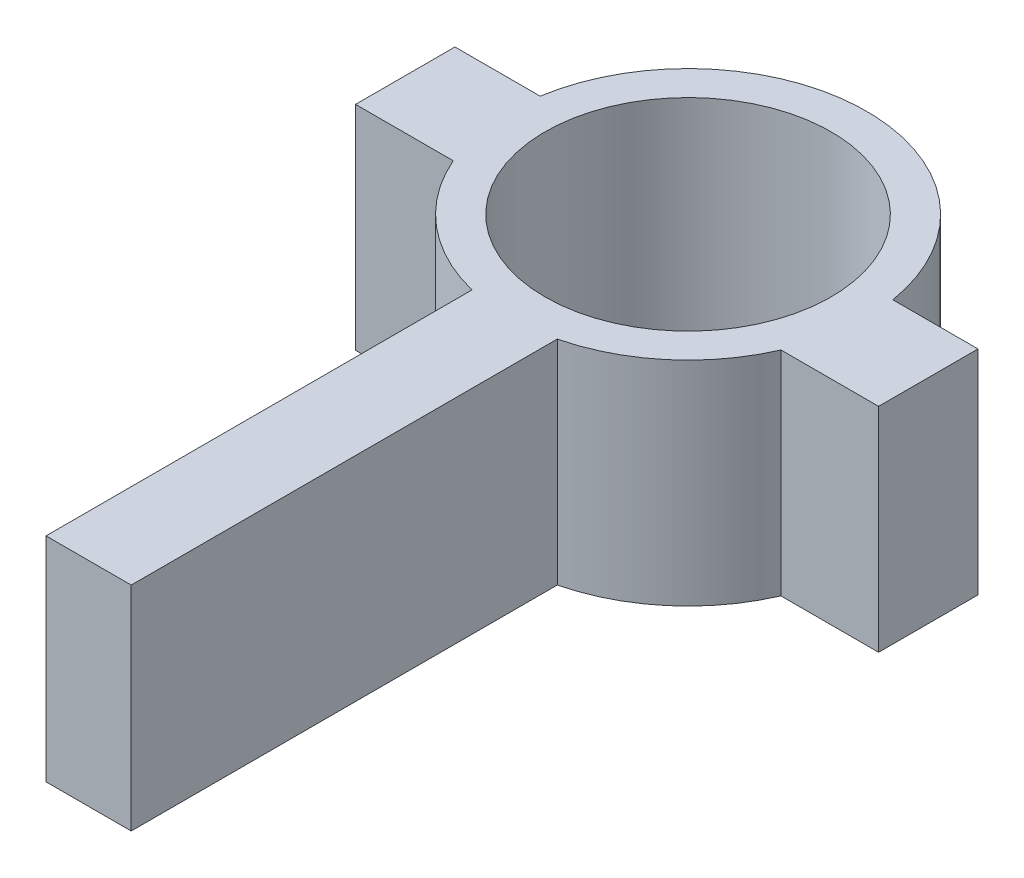
ISO-10303-21;
HEADER;
FILE_DESCRIPTION(('STEP AP214'),'2;1');
FILE_NAME('part.step','',(''),(''),'','','');
FILE_SCHEMA(('AUTOMOTIVE_DESIGN { 1 0 10303 214 1 1 1 1 }'));
ENDSEC;
DATA;
#1=APPLICATION_CONTEXT('core data for automotive mechanical design processes');
#2=APPLICATION_PROTOCOL_DEFINITION('international standard','automotive_design',2000,#1);
#3=PRODUCT_CONTEXT('',#1,'mechanical');
#4=PRODUCT('Part','Part','',(#3));
#5=PRODUCT_RELATED_PRODUCT_CATEGORY('part','',(#4));
#6=PRODUCT_DEFINITION_FORMATION('','',#4);
#7=PRODUCT_DEFINITION_CONTEXT('part definition',#1,'design');
#8=PRODUCT_DEFINITION('design','',#6,#7);
#9=PRODUCT_DEFINITION_SHAPE('','',#8);
#10=(LENGTH_UNIT() NAMED_UNIT(*) SI_UNIT(.MILLI.,.METRE.));
#11=(NAMED_UNIT(*) PLANE_ANGLE_UNIT() SI_UNIT($,.RADIAN.));
#12=(NAMED_UNIT(*) SI_UNIT($,.STERADIAN.) SOLID_ANGLE_UNIT());
#13=UNCERTAINTY_MEASURE_WITH_UNIT(LENGTH_MEASURE(1.E-05),#10,'distance_accuracy_value','');
#14=(GEOMETRIC_REPRESENTATION_CONTEXT(3) GLOBAL_UNCERTAINTY_ASSIGNED_CONTEXT((#13)) GLOBAL_UNIT_ASSIGNED_CONTEXT((#10,
#11,#12)) REPRESENTATION_CONTEXT('',''));
#15=CARTESIAN_POINT('',(0.,0.,0.));
#16=DIRECTION('',(0.,0.,1.));
#17=DIRECTION('',(1.,0.,0.));
#18=AXIS2_PLACEMENT_3D('',#15,#16,#17);
#19=CARTESIAN_POINT('',(0.,30.,10.));
#20=DIRECTION('',(0.,0.,-1.));
#21=DIRECTION('',(-1.,0.,0.));
#22=AXIS2_PLACEMENT_3D('',#19,#20,#21);
#23=PLANE('',#22);
#24=DIRECTION('',(1.,0.,0.));
#25=VECTOR('',#24,1.);
#26=CARTESIAN_POINT('',(0.,0.,10.));
#27=LINE('',#26,#25);
#28=CARTESIAN_POINT('',(23.0764490335927,0.,10.));
#29=VERTEX_POINT('',#28);
#30=CARTESIAN_POINT('',(36.8298711233063,0.,9.99999999999999));
#31=VERTEX_POINT('',#30);
#32=EDGE_CURVE('E174',#29,#31,#27,.T.);
#33=ORIENTED_EDGE('',*,*,#32,.T.);
#34=DIRECTION('',(0.,-1.,0.));
#35=VECTOR('',#34,1.);
#36=CARTESIAN_POINT('',(36.8298711233063,30.,9.99999999999999));
#37=LINE('',#36,#35);
#38=CARTESIAN_POINT('',(36.8298711233063,30.,9.99999999999999));
#39=VERTEX_POINT('',#38);
#40=EDGE_CURVE('E11',#39,#31,#37,.T.);
#41=ORIENTED_EDGE('',*,*,#40,.F.);
#42=DIRECTION('',(1.,0.,0.));
#43=VECTOR('',#42,1.);
#44=CARTESIAN_POINT('',(0.,30.,10.));
#45=LINE('',#44,#43);
#46=CARTESIAN_POINT('',(23.0764490335927,30.,10.));
#47=VERTEX_POINT('',#46);
#48=EDGE_CURVE('E110',#47,#39,#45,.T.);
#49=ORIENTED_EDGE('',*,*,#48,.F.);
#50=DIRECTION('',(0.,-1.,0.));
#51=VECTOR('',#50,1.);
#52=CARTESIAN_POINT('',(23.0764490335927,30.,10.));
#53=LINE('',#52,#51);
#54=EDGE_CURVE('E173',#47,#29,#53,.T.);
#55=ORIENTED_EDGE('',*,*,#54,.T.);
#56=EDGE_LOOP('',(#33,#41,#49,#55));
#57=FACE_BOUND('',#56,.T.);
#58=ADVANCED_FACE('F45',(#57),#23,.F.);
#59=CARTESIAN_POINT('',(36.8298711233063,30.,0.));
#60=DIRECTION('',(1.,0.,0.));
#61=DIRECTION('',(0.,0.,-1.));
#62=AXIS2_PLACEMENT_3D('',#59,#60,#61);
#63=PLANE('',#62);
#64=DIRECTION('',(0.,0.,1.));
#65=VECTOR('',#64,1.);
#66=CARTESIAN_POINT('',(36.8298711233063,0.,0.));
#67=LINE('',#66,#65);
#68=CARTESIAN_POINT('',(36.8298711233063,0.,-4.00000000000001));
#69=VERTEX_POINT('',#68);
#70=EDGE_CURVE('E178',#69,#31,#67,.T.);
#71=ORIENTED_EDGE('',*,*,#70,.F.);
#72=DIRECTION('',(0.,-1.,0.));
#73=VECTOR('',#72,1.);
#74=CARTESIAN_POINT('',(36.8298711233063,30.,-4.00000000000001));
#75=LINE('',#74,#73);
#76=CARTESIAN_POINT('',(36.8298711233063,30.,-4.00000000000001));
#77=VERTEX_POINT('',#76);
#78=EDGE_CURVE('E54',#77,#69,#75,.T.);
#79=ORIENTED_EDGE('',*,*,#78,.F.);
#80=DIRECTION('',(0.,0.,1.));
#81=VECTOR('',#80,1.);
#82=CARTESIAN_POINT('',(36.8298711233063,30.,0.));
#83=LINE('',#82,#81);
#84=EDGE_CURVE('E296',#77,#39,#83,.T.);
#85=ORIENTED_EDGE('',*,*,#84,.T.);
#86=ORIENTED_EDGE('',*,*,#40,.T.);
#87=EDGE_LOOP('',(#71,#79,#85,#86));
#88=FACE_BOUND('',#87,.T.);
#89=ADVANCED_FACE('F251',(#88),#63,.T.);
#90=CARTESIAN_POINT('',(0.,30.,-3.99999999999998));
#91=DIRECTION('',(0.,0.,-1.));
#92=DIRECTION('',(-1.,0.,0.));
#93=AXIS2_PLACEMENT_3D('',#90,#91,#92);
#94=PLANE('',#93);
#95=DIRECTION('',(1.,0.,0.));
#96=VECTOR('',#95,1.);
#97=CARTESIAN_POINT('',(0.,0.,-3.99999999999998));
#98=LINE('',#97,#96);
#99=CARTESIAN_POINT('',(24.8298711233063,0.,-4.));
#100=VERTEX_POINT('',#99);
#101=EDGE_CURVE('E182',#100,#69,#98,.T.);
#102=ORIENTED_EDGE('',*,*,#101,.F.);
#103=DIRECTION('',(0.,-1.,0.));
#104=VECTOR('',#103,1.);
#105=CARTESIAN_POINT('',(24.8298711233063,30.,-4.));
#106=LINE('',#105,#104);
#107=CARTESIAN_POINT('',(24.8298711233063,30.,-4.));
#108=VERTEX_POINT('',#107);
#109=EDGE_CURVE('E239',#108,#100,#106,.T.);
#110=ORIENTED_EDGE('',*,*,#109,.F.);
#111=DIRECTION('',(1.,0.,0.));
#112=VECTOR('',#111,1.);
#113=CARTESIAN_POINT('',(0.,30.,-3.99999999999998));
#114=LINE('',#113,#112);
#115=EDGE_CURVE('E248',#108,#77,#114,.T.);
#116=ORIENTED_EDGE('',*,*,#115,.T.);
#117=ORIENTED_EDGE('',*,*,#78,.T.);
#118=EDGE_LOOP('',(#102,#110,#116,#117));
#119=FACE_BOUND('',#118,.T.);
#120=ADVANCED_FACE('F246',(#119),#94,.T.);
#121=CARTESIAN_POINT('',(0.,30.,0.));
#122=DIRECTION('',(0.,-1.,0.));
#123=DIRECTION('',(0.,0.,-1.));
#124=AXIS2_PLACEMENT_3D('',#121,#122,#123);
#125=CYLINDRICAL_SURFACE('',#124,25.15);
#126=CARTESIAN_POINT('',(0.,0.,0.));
#127=DIRECTION('',(0.,1.,0.));
#128=DIRECTION('',(0.,0.,1.));
#129=AXIS2_PLACEMENT_3D('',#126,#127,#128);
#130=CIRCLE('',#129,25.15);
#131=CARTESIAN_POINT('',(-24.8298711233063,0.,-4.));
#132=VERTEX_POINT('',#131);
#133=EDGE_CURVE('E186',#100,#132,#130,.T.);
#134=ORIENTED_EDGE('',*,*,#133,.T.);
#135=DIRECTION('',(0.,-1.,0.));
#136=VECTOR('',#135,1.);
#137=CARTESIAN_POINT('',(-24.8298711233063,30.,-4.));
#138=LINE('',#137,#136);
#139=CARTESIAN_POINT('',(-24.8298711233063,30.,-4.));
#140=VERTEX_POINT('',#139);
#141=EDGE_CURVE('E235',#140,#132,#138,.T.);
#142=ORIENTED_EDGE('',*,*,#141,.F.);
#143=CARTESIAN_POINT('',(0.,30.,0.));
#144=DIRECTION('',(0.,1.,0.));
#145=DIRECTION('',(0.,0.,1.));
#146=AXIS2_PLACEMENT_3D('',#143,#144,#145);
#147=CIRCLE('',#146,25.15);
#148=EDGE_CURVE('E271',#108,#140,#147,.T.);
#149=ORIENTED_EDGE('',*,*,#148,.F.);
#150=ORIENTED_EDGE('',*,*,#109,.T.);
#151=EDGE_LOOP('',(#134,#142,#149,#150));
#152=FACE_BOUND('',#151,.T.);
#153=ADVANCED_FACE('F261',(#152),#125,.T.);
#154=CARTESIAN_POINT('',(0.,30.,-4.));
#155=DIRECTION('',(0.,0.,1.));
#156=DIRECTION('',(1.,0.,0.));
#157=AXIS2_PLACEMENT_3D('',#154,#155,#156);
#158=PLANE('',#157);
#159=DIRECTION('',(-1.,0.,0.));
#160=VECTOR('',#159,1.);
#161=CARTESIAN_POINT('',(0.,0.,-4.));
#162=LINE('',#161,#160);
#163=CARTESIAN_POINT('',(-36.8298711233063,0.,-4.));
#164=VERTEX_POINT('',#163);
#165=EDGE_CURVE('E189',#132,#164,#162,.T.);
#166=ORIENTED_EDGE('',*,*,#165,.T.);
#167=DIRECTION('',(0.,-1.,0.));
#168=VECTOR('',#167,1.);
#169=CARTESIAN_POINT('',(-36.8298711233063,30.,-4.));
#170=LINE('',#169,#168);
#171=CARTESIAN_POINT('',(-36.8298711233063,30.,-4.));
#172=VERTEX_POINT('',#171);
#173=EDGE_CURVE('E231',#172,#164,#170,.T.);
#174=ORIENTED_EDGE('',*,*,#173,.F.);
#175=DIRECTION('',(-1.,0.,0.));
#176=VECTOR('',#175,1.);
#177=CARTESIAN_POINT('',(0.,30.,-4.));
#178=LINE('',#177,#176);
#179=EDGE_CURVE('E267',#140,#172,#178,.T.);
#180=ORIENTED_EDGE('',*,*,#179,.F.);
#181=ORIENTED_EDGE('',*,*,#141,.T.);
#182=EDGE_LOOP('',(#166,#174,#180,#181));
#183=FACE_BOUND('',#182,.T.);
#184=ADVANCED_FACE('F265',(#183),#158,.F.);
#185=CARTESIAN_POINT('',(-36.8298711233063,30.,0.));
#186=DIRECTION('',(1.,0.,0.));
#187=DIRECTION('',(0.,0.,-1.));
#188=AXIS2_PLACEMENT_3D('',#185,#186,#187);
#189=PLANE('',#188);
#190=DIRECTION('',(0.,0.,1.));
#191=VECTOR('',#190,1.);
#192=CARTESIAN_POINT('',(-36.8298711233063,0.,0.));
#193=LINE('',#192,#191);
#194=CARTESIAN_POINT('',(-36.8298711233063,0.,10.));
#195=VERTEX_POINT('',#194);
#196=EDGE_CURVE('E192',#164,#195,#193,.T.);
#197=ORIENTED_EDGE('',*,*,#196,.T.);
#198=DIRECTION('',(0.,-1.,0.));
#199=VECTOR('',#198,1.);
#200=CARTESIAN_POINT('',(-36.8298711233063,30.,10.));
#201=LINE('',#200,#199);
#202=CARTESIAN_POINT('',(-36.8298711233063,30.,10.));
#203=VERTEX_POINT('',#202);
#204=EDGE_CURVE('E227',#203,#195,#201,.T.);
#205=ORIENTED_EDGE('',*,*,#204,.F.);
#206=DIRECTION('',(0.,0.,1.));
#207=VECTOR('',#206,1.);
#208=CARTESIAN_POINT('',(-36.8298711233063,30.,0.));
#209=LINE('',#208,#207);
#210=EDGE_CURVE('E270',#172,#203,#209,.T.);
#211=ORIENTED_EDGE('',*,*,#210,.F.);
#212=ORIENTED_EDGE('',*,*,#173,.T.);
#213=EDGE_LOOP('',(#197,#205,#211,#212));
#214=FACE_BOUND('',#213,.T.);
#215=ADVANCED_FACE('F327',(#214),#189,.F.);
#216=CARTESIAN_POINT('',(0.,30.,10.));
#217=DIRECTION('',(0.,0.,-1.));
#218=DIRECTION('',(-1.,0.,0.));
#219=AXIS2_PLACEMENT_3D('',#216,#217,#218);
#220=PLANE('',#219);
#221=DIRECTION('',(1.,0.,0.));
#222=VECTOR('',#221,1.);
#223=CARTESIAN_POINT('',(0.,0.,10.));
#224=LINE('',#223,#222);
#225=CARTESIAN_POINT('',(-23.0764490335927,0.,10.));
#226=VERTEX_POINT('',#225);
#227=EDGE_CURVE('E195',#195,#226,#224,.T.);
#228=ORIENTED_EDGE('',*,*,#227,.T.);
#229=DIRECTION('',(0.,-1.,0.));
#230=VECTOR('',#229,1.);
#231=CARTESIAN_POINT('',(-23.0764490335927,30.,10.));
#232=LINE('',#231,#230);
#233=CARTESIAN_POINT('',(-23.0764490335927,30.,10.));
#234=VERTEX_POINT('',#233);
#235=EDGE_CURVE('E223',#234,#226,#232,.T.);
#236=ORIENTED_EDGE('',*,*,#235,.F.);
#237=DIRECTION('',(1.,0.,0.));
#238=VECTOR('',#237,1.);
#239=CARTESIAN_POINT('',(0.,30.,10.));
#240=LINE('',#239,#238);
#241=EDGE_CURVE('E275',#203,#234,#240,.T.);
#242=ORIENTED_EDGE('',*,*,#241,.F.);
#243=ORIENTED_EDGE('',*,*,#204,.T.);
#244=EDGE_LOOP('',(#228,#236,#242,#243));
#245=FACE_BOUND('',#244,.T.);
#246=ADVANCED_FACE('F313',(#245),#220,.F.);
#247=CARTESIAN_POINT('',(0.,30.,0.));
#248=DIRECTION('',(0.,-1.,0.));
#249=DIRECTION('',(0.,0.,-1.));
#250=AXIS2_PLACEMENT_3D('',#247,#248,#249);
#251=CYLINDRICAL_SURFACE('',#250,25.15);
#252=CARTESIAN_POINT('',(0.,0.,0.));
#253=DIRECTION('',(0.,1.,0.));
#254=DIRECTION('',(0.,0.,1.));
#255=AXIS2_PLACEMENT_3D('',#252,#253,#254);
#256=CIRCLE('',#255,25.15);
#257=CARTESIAN_POINT('',(-6.,0.,24.4238101040767));
#258=VERTEX_POINT('',#257);
#259=EDGE_CURVE('E198',#226,#258,#256,.T.);
#260=ORIENTED_EDGE('',*,*,#259,.T.);
#261=DIRECTION('',(0.,-1.,0.));
#262=VECTOR('',#261,1.);
#263=CARTESIAN_POINT('',(-6.,30.,24.4238101040767));
#264=LINE('',#263,#262);
#265=CARTESIAN_POINT('',(-6.,30.,24.4238101040767));
#266=VERTEX_POINT('',#265);
#267=EDGE_CURVE('E219',#266,#258,#264,.T.);
#268=ORIENTED_EDGE('',*,*,#267,.F.);
#269=CARTESIAN_POINT('',(0.,30.,0.));
#270=DIRECTION('',(0.,1.,0.));
#271=DIRECTION('',(0.,0.,1.));
#272=AXIS2_PLACEMENT_3D('',#269,#270,#271);
#273=CIRCLE('',#272,25.15);
#274=EDGE_CURVE('E167',#234,#266,#273,.T.);
#275=ORIENTED_EDGE('',*,*,#274,.F.);
#276=ORIENTED_EDGE('',*,*,#235,.T.);
#277=EDGE_LOOP('',(#260,#268,#275,#276));
#278=FACE_BOUND('',#277,.T.);
#279=ADVANCED_FACE('F288',(#278),#251,.T.);
#280=CARTESIAN_POINT('',(-6.,30.,0.));
#281=DIRECTION('',(1.,0.,0.));
#282=DIRECTION('',(0.,0.,-1.));
#283=AXIS2_PLACEMENT_3D('',#280,#281,#282);
#284=PLANE('',#283);
#285=DIRECTION('',(0.,0.,1.));
#286=VECTOR('',#285,1.);
#287=CARTESIAN_POINT('',(-6.,0.,0.));
#288=LINE('',#287,#286);
#289=CARTESIAN_POINT('',(-5.99999999999999,0.,84.4238101040767));
#290=VERTEX_POINT('',#289);
#291=EDGE_CURVE('E201',#258,#290,#288,.T.);
#292=ORIENTED_EDGE('',*,*,#291,.T.);
#293=DIRECTION('',(0.,-1.,0.));
#294=VECTOR('',#293,1.);
#295=CARTESIAN_POINT('',(-5.99999999999999,30.,84.4238101040767));
#296=LINE('',#295,#294);
#297=CARTESIAN_POINT('',(-5.99999999999999,30.,84.4238101040767));
#298=VERTEX_POINT('',#297);
#299=EDGE_CURVE('E159',#298,#290,#296,.T.);
#300=ORIENTED_EDGE('',*,*,#299,.F.);
#301=DIRECTION('',(0.,0.,1.));
#302=VECTOR('',#301,1.);
#303=CARTESIAN_POINT('',(-6.,30.,0.));
#304=LINE('',#303,#302);
#305=EDGE_CURVE('E144',#266,#298,#304,.T.);
#306=ORIENTED_EDGE('',*,*,#305,.F.);
#307=ORIENTED_EDGE('',*,*,#267,.T.);
#308=EDGE_LOOP('',(#292,#300,#306,#307));
#309=FACE_BOUND('',#308,.T.);
#310=ADVANCED_FACE('F292',(#309),#284,.F.);
#311=CARTESIAN_POINT('',(0.,30.,84.4238101040767));
#312=DIRECTION('',(0.,0.,-1.));
#313=DIRECTION('',(-1.,0.,0.));
#314=AXIS2_PLACEMENT_3D('',#311,#312,#313);
#315=PLANE('',#314);
#316=DIRECTION('',(1.,0.,0.));
#317=VECTOR('',#316,1.);
#318=CARTESIAN_POINT('',(0.,0.,84.4238101040767));
#319=LINE('',#318,#317);
#320=CARTESIAN_POINT('',(5.99999999999999,0.,84.4238101040767));
#321=VERTEX_POINT('',#320);
#322=EDGE_CURVE('E154',#290,#321,#319,.T.);
#323=ORIENTED_EDGE('',*,*,#322,.T.);
#324=DIRECTION('',(0.,-1.,0.));
#325=VECTOR('',#324,1.);
#326=CARTESIAN_POINT('',(5.99999999999999,30.,84.4238101040767));
#327=LINE('',#326,#325);
#328=CARTESIAN_POINT('',(5.99999999999999,30.,84.4238101040767));
#329=VERTEX_POINT('',#328);
#330=EDGE_CURVE('E151',#329,#321,#327,.T.);
#331=ORIENTED_EDGE('',*,*,#330,.F.);
#332=DIRECTION('',(1.,0.,0.));
#333=VECTOR('',#332,1.);
#334=CARTESIAN_POINT('',(0.,30.,84.4238101040767));
#335=LINE('',#334,#333);
#336=EDGE_CURVE('E137',#298,#329,#335,.T.);
#337=ORIENTED_EDGE('',*,*,#336,.F.);
#338=ORIENTED_EDGE('',*,*,#299,.T.);
#339=EDGE_LOOP('',(#323,#331,#337,#338));
#340=FACE_BOUND('',#339,.T.);
#341=ADVANCED_FACE('F152',(#340),#315,.F.);
#342=CARTESIAN_POINT('',(6.,30.,0.));
#343=DIRECTION('',(1.,0.,0.));
#344=DIRECTION('',(0.,0.,-1.));
#345=AXIS2_PLACEMENT_3D('',#342,#343,#344);
#346=PLANE('',#345);
#347=DIRECTION('',(0.,0.,1.));
#348=VECTOR('',#347,1.);
#349=CARTESIAN_POINT('',(6.,0.,0.));
#350=LINE('',#349,#348);
#351=CARTESIAN_POINT('',(6.,0.,24.4238101040767));
#352=VERTEX_POINT('',#351);
#353=EDGE_CURVE('E206',#352,#321,#350,.T.);
#354=ORIENTED_EDGE('',*,*,#353,.F.);
#355=DIRECTION('',(0.,-1.,0.));
#356=VECTOR('',#355,1.);
#357=CARTESIAN_POINT('',(6.,30.,24.4238101040767));
#358=LINE('',#357,#356);
#359=CARTESIAN_POINT('',(6.,30.,24.4238101040767));
#360=VERTEX_POINT('',#359);
#361=EDGE_CURVE('E101',#360,#352,#358,.T.);
#362=ORIENTED_EDGE('',*,*,#361,.F.);
#363=DIRECTION('',(0.,0.,1.));
#364=VECTOR('',#363,1.);
#365=CARTESIAN_POINT('',(6.,30.,0.));
#366=LINE('',#365,#364);
#367=EDGE_CURVE('E142',#360,#329,#366,.T.);
#368=ORIENTED_EDGE('',*,*,#367,.T.);
#369=ORIENTED_EDGE('',*,*,#330,.T.);
#370=EDGE_LOOP('',(#354,#362,#368,#369));
#371=FACE_BOUND('',#370,.T.);
#372=ADVANCED_FACE('F161',(#371),#346,.T.);
#373=EDGE_CURVE('E104',#352,#29,#256,.T.);
#374=ORIENTED_EDGE('',*,*,#373,.T.);
#375=ORIENTED_EDGE('',*,*,#54,.F.);
#376=EDGE_CURVE('E62',#360,#47,#273,.T.);
#377=ORIENTED_EDGE('',*,*,#376,.F.);
#378=ORIENTED_EDGE('',*,*,#361,.T.);
#379=EDGE_LOOP('',(#374,#375,#377,#378));
#380=FACE_BOUND('',#379,.T.);
#381=ADVANCED_FACE('F301',(#380),#251,.T.);
#382=CARTESIAN_POINT('',(0.,30.,0.));
#383=DIRECTION('',(0.,-1.,0.));
#384=DIRECTION('',(0.,0.,-1.));
#385=AXIS2_PLACEMENT_3D('',#382,#383,#384);
#386=CYLINDRICAL_SURFACE('',#385,20.15);
#387=CARTESIAN_POINT('',(0.,30.,0.));
#388=DIRECTION('',(0.,1.,0.));
#389=DIRECTION('',(0.,0.,1.));
#390=AXIS2_PLACEMENT_3D('',#387,#388,#389);
#391=CIRCLE('',#390,20.15);
#392=CARTESIAN_POINT('',(0.,30.,20.15));
#393=VERTEX_POINT('',#392);
#394=EDGE_CURVE('E165',#393,#393,#391,.T.);
#395=ORIENTED_EDGE('',*,*,#394,.T.);
#396=EDGE_LOOP('',(#395));
#397=FACE_BOUND('',#396,.T.);
#398=CARTESIAN_POINT('',(0.,0.,0.));
#399=DIRECTION('',(0.,1.,0.));
#400=DIRECTION('',(0.,0.,1.));
#401=AXIS2_PLACEMENT_3D('',#398,#399,#400);
#402=CIRCLE('',#401,20.15);
#403=CARTESIAN_POINT('',(0.,0.,20.15));
#404=VERTEX_POINT('',#403);
#405=EDGE_CURVE('E209',#404,#404,#402,.T.);
#406=ORIENTED_EDGE('',*,*,#405,.F.);
#407=EDGE_LOOP('',(#406));
#408=FACE_BOUND('',#407,.T.);
#409=ADVANCED_FACE('F303',(#397,#408),#386,.F.);
#410=CARTESIAN_POINT('',(0.,30.,0.));
#411=DIRECTION('',(0.,1.,0.));
#412=DIRECTION('',(0.,0.,1.));
#413=AXIS2_PLACEMENT_3D('',#410,#411,#412);
#414=PLANE('',#413);
#415=ORIENTED_EDGE('',*,*,#48,.T.);
#416=ORIENTED_EDGE('',*,*,#84,.F.);
#417=ORIENTED_EDGE('',*,*,#115,.F.);
#418=ORIENTED_EDGE('',*,*,#148,.T.);
#419=ORIENTED_EDGE('',*,*,#179,.T.);
#420=ORIENTED_EDGE('',*,*,#210,.T.);
#421=ORIENTED_EDGE('',*,*,#241,.T.);
#422=ORIENTED_EDGE('',*,*,#274,.T.);
#423=ORIENTED_EDGE('',*,*,#305,.T.);
#424=ORIENTED_EDGE('',*,*,#336,.T.);
#425=ORIENTED_EDGE('',*,*,#367,.F.);
#426=ORIENTED_EDGE('',*,*,#376,.T.);
#427=EDGE_LOOP('',(#415,#416,#417,#418,#419,#420,#421,#422,#423,#424,#425,#426));
#428=FACE_BOUND('',#427,.T.);
#429=ORIENTED_EDGE('',*,*,#394,.F.);
#430=EDGE_LOOP('',(#429));
#431=FACE_BOUND('',#430,.T.);
#432=ADVANCED_FACE('F139',(#428,#431),#414,.T.);
#433=CARTESIAN_POINT('',(0.,0.,0.));
#434=DIRECTION('',(0.,1.,0.));
#435=DIRECTION('',(0.,0.,1.));
#436=AXIS2_PLACEMENT_3D('',#433,#434,#435);
#437=PLANE('',#436);
#438=ORIENTED_EDGE('',*,*,#32,.F.);
#439=ORIENTED_EDGE('',*,*,#373,.F.);
#440=ORIENTED_EDGE('',*,*,#353,.T.);
#441=ORIENTED_EDGE('',*,*,#322,.F.);
#442=ORIENTED_EDGE('',*,*,#291,.F.);
#443=ORIENTED_EDGE('',*,*,#259,.F.);
#444=ORIENTED_EDGE('',*,*,#227,.F.);
#445=ORIENTED_EDGE('',*,*,#196,.F.);
#446=ORIENTED_EDGE('',*,*,#165,.F.);
#447=ORIENTED_EDGE('',*,*,#133,.F.);
#448=ORIENTED_EDGE('',*,*,#101,.T.);
#449=ORIENTED_EDGE('',*,*,#70,.T.);
#450=EDGE_LOOP('',(#438,#439,#440,#441,#442,#443,#444,#445,#446,#447,#448,#449));
#451=FACE_BOUND('',#450,.T.);
#452=ORIENTED_EDGE('',*,*,#405,.T.);
#453=EDGE_LOOP('',(#452));
#454=FACE_BOUND('',#453,.T.);
#455=ADVANCED_FACE('F255',(#451,#454),#437,.F.);
#456=CLOSED_SHELL('',(#58,#89,#120,#153,#184,#215,#246,#279,#310,#341,#372,#381,#409,#432,#455));
#457=MANIFOLD_SOLID_BREP('B2',#456);
#458=ADVANCED_BREP_SHAPE_REPRESENTATION('',(#18,#457),#14);
#459=SHAPE_DEFINITION_REPRESENTATION(#9,#458);
ENDSEC;
END-ISO-10303-21;
